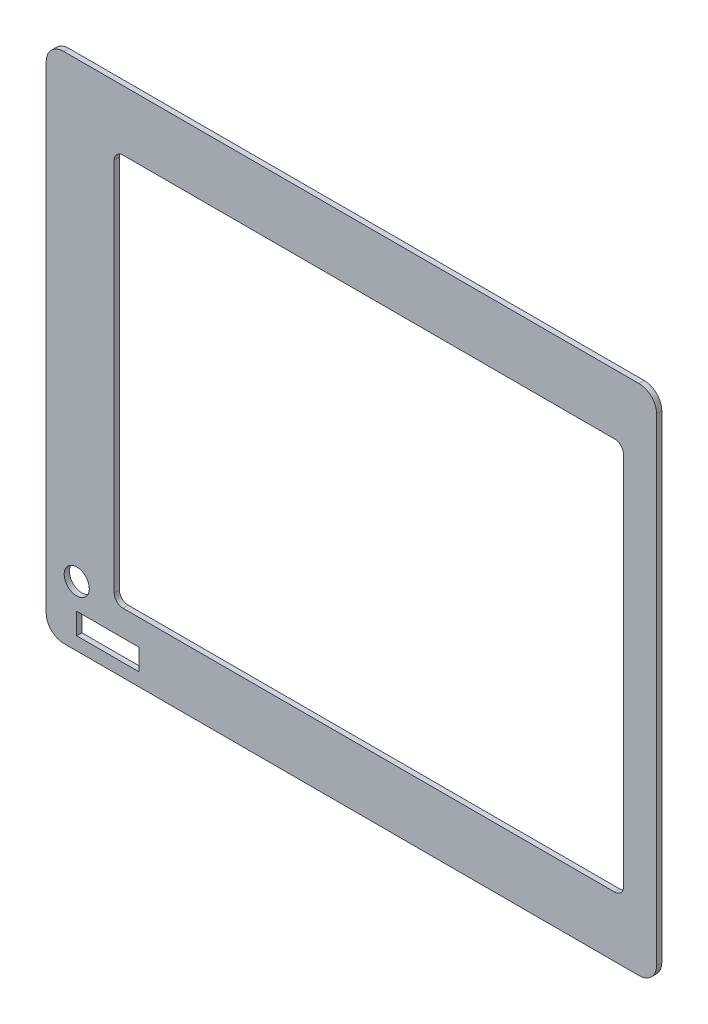
ISO-10303-21;
HEADER;
FILE_DESCRIPTION(('STEP AP214'),'2;1');
FILE_NAME('part.step','',(''),(''),'','','');
FILE_SCHEMA(('AUTOMOTIVE_DESIGN { 1 0 10303 214 1 1 1 1 }'));
ENDSEC;
DATA;
#1=APPLICATION_CONTEXT('core data for automotive mechanical design processes');
#2=APPLICATION_PROTOCOL_DEFINITION('international standard','automotive_design',2000,#1);
#3=PRODUCT_CONTEXT('',#1,'mechanical');
#4=PRODUCT('Part','Part','',(#3));
#5=PRODUCT_RELATED_PRODUCT_CATEGORY('part','',(#4));
#6=PRODUCT_DEFINITION_FORMATION('','',#4);
#7=PRODUCT_DEFINITION_CONTEXT('part definition',#1,'design');
#8=PRODUCT_DEFINITION('design','',#6,#7);
#9=PRODUCT_DEFINITION_SHAPE('','',#8);
#10=(LENGTH_UNIT() NAMED_UNIT(*) SI_UNIT(.MILLI.,.METRE.));
#11=(NAMED_UNIT(*) PLANE_ANGLE_UNIT() SI_UNIT($,.RADIAN.));
#12=(NAMED_UNIT(*) SI_UNIT($,.STERADIAN.) SOLID_ANGLE_UNIT());
#13=UNCERTAINTY_MEASURE_WITH_UNIT(LENGTH_MEASURE(1.E-05),#10,'distance_accuracy_value','');
#14=(GEOMETRIC_REPRESENTATION_CONTEXT(3) GLOBAL_UNCERTAINTY_ASSIGNED_CONTEXT((#13)) GLOBAL_UNIT_ASSIGNED_CONTEXT((#10,
#11,#12)) REPRESENTATION_CONTEXT('',''));
#15=CARTESIAN_POINT('',(0.,0.,0.));
#16=DIRECTION('',(0.,0.,1.));
#17=DIRECTION('',(1.,0.,0.));
#18=AXIS2_PLACEMENT_3D('',#15,#16,#17);
#19=CARTESIAN_POINT('',(0.,0.,6.));
#20=DIRECTION('',(0.,0.,-1.));
#21=DIRECTION('',(-1.,0.,0.));
#22=AXIS2_PLACEMENT_3D('',#19,#20,#21);
#23=PLANE('',#22);
#24=CARTESIAN_POINT('',(-315.,-225.,6.));
#25=DIRECTION('',(0.,0.,1.));
#26=DIRECTION('',(1.,0.,0.));
#27=AXIS2_PLACEMENT_3D('',#24,#25,#26);
#28=CIRCLE('',#27,14.4);
#29=CARTESIAN_POINT('',(-300.6,-225.,6.));
#30=VERTEX_POINT('',#29);
#31=EDGE_CURVE('E191',#30,#30,#28,.T.);
#32=ORIENTED_EDGE('',*,*,#31,.F.);
#33=EDGE_LOOP('',(#32));
#34=FACE_BOUND('',#33,.T.);
#35=DIRECTION('',(0.,1.,0.));
#36=VECTOR('',#35,1.);
#37=CARTESIAN_POINT('',(-243.7,-279.,6.));
#38=LINE('',#37,#36);
#39=CARTESIAN_POINT('',(-243.7,-279.,6.));
#40=VERTEX_POINT('',#39);
#41=CARTESIAN_POINT('',(-243.7,-254.6,6.));
#42=VERTEX_POINT('',#41);
#43=EDGE_CURVE('E206',#40,#42,#38,.T.);
#44=ORIENTED_EDGE('',*,*,#43,.F.);
#45=DIRECTION('',(1.,0.,0.));
#46=VECTOR('',#45,1.);
#47=CARTESIAN_POINT('',(-315.,-279.,6.));
#48=LINE('',#47,#46);
#49=CARTESIAN_POINT('',(-315.,-279.,6.));
#50=VERTEX_POINT('',#49);
#51=EDGE_CURVE('E63',#50,#40,#48,.T.);
#52=ORIENTED_EDGE('',*,*,#51,.F.);
#53=DIRECTION('',(0.,1.,0.));
#54=VECTOR('',#53,1.);
#55=CARTESIAN_POINT('',(-315.,-279.,6.));
#56=LINE('',#55,#54);
#57=CARTESIAN_POINT('',(-315.,-254.6,6.));
#58=VERTEX_POINT('',#57);
#59=EDGE_CURVE('E194',#50,#58,#56,.T.);
#60=ORIENTED_EDGE('',*,*,#59,.T.);
#61=DIRECTION('',(1.,0.,0.));
#62=VECTOR('',#61,1.);
#63=CARTESIAN_POINT('',(-315.,-254.6,6.));
#64=LINE('',#63,#62);
#65=EDGE_CURVE('E200',#58,#42,#64,.T.);
#66=ORIENTED_EDGE('',*,*,#65,.T.);
#67=EDGE_LOOP('',(#44,#52,#60,#66));
#68=FACE_BOUND('',#67,.T.);
#69=DIRECTION('',(-1.,0.,0.));
#70=VECTOR('',#69,1.);
#71=CARTESIAN_POINT('',(-350.,294.,6.));
#72=LINE('',#71,#70);
#73=CARTESIAN_POINT('',(330.,294.,6.));
#74=VERTEX_POINT('',#73);
#75=CARTESIAN_POINT('',(-330.,294.,6.));
#76=VERTEX_POINT('',#75);
#77=EDGE_CURVE('E255',#74,#76,#72,.T.);
#78=ORIENTED_EDGE('',*,*,#77,.T.);
#79=CARTESIAN_POINT('',(-330.,274.,6.));
#80=DIRECTION('',(0.,0.,-1.));
#81=DIRECTION('',(-1.,0.,0.));
#82=AXIS2_PLACEMENT_3D('',#79,#80,#81);
#83=CIRCLE('',#82,20.);
#84=CARTESIAN_POINT('',(-350.,274.,6.));
#85=VERTEX_POINT('',#84);
#86=EDGE_CURVE('E318',#76,#85,#83,.F.);
#87=ORIENTED_EDGE('',*,*,#86,.T.);
#88=DIRECTION('',(0.,-1.,0.));
#89=VECTOR('',#88,1.);
#90=CARTESIAN_POINT('',(-350.,-294.,6.));
#91=LINE('',#90,#89);
#92=CARTESIAN_POINT('',(-350.,-274.,6.));
#93=VERTEX_POINT('',#92);
#94=EDGE_CURVE('E260',#85,#93,#91,.T.);
#95=ORIENTED_EDGE('',*,*,#94,.T.);
#96=CARTESIAN_POINT('',(-330.,-274.,6.));
#97=DIRECTION('',(0.,0.,-1.));
#98=DIRECTION('',(-1.,0.,0.));
#99=AXIS2_PLACEMENT_3D('',#96,#97,#98);
#100=CIRCLE('',#99,20.);
#101=CARTESIAN_POINT('',(-330.,-294.,6.));
#102=VERTEX_POINT('',#101);
#103=EDGE_CURVE('E309',#93,#102,#100,.F.);
#104=ORIENTED_EDGE('',*,*,#103,.T.);
#105=DIRECTION('',(1.,0.,0.));
#106=VECTOR('',#105,1.);
#107=CARTESIAN_POINT('',(-350.,-294.,6.));
#108=LINE('',#107,#106);
#109=CARTESIAN_POINT('',(330.,-294.,6.));
#110=VERTEX_POINT('',#109);
#111=EDGE_CURVE('E264',#102,#110,#108,.T.);
#112=ORIENTED_EDGE('',*,*,#111,.T.);
#113=CARTESIAN_POINT('',(330.,-274.,6.));
#114=DIRECTION('',(0.,0.,-1.));
#115=DIRECTION('',(-1.,0.,0.));
#116=AXIS2_PLACEMENT_3D('',#113,#114,#115);
#117=CIRCLE('',#116,20.);
#118=CARTESIAN_POINT('',(350.,-274.,6.));
#119=VERTEX_POINT('',#118);
#120=EDGE_CURVE('E312',#110,#119,#117,.F.);
#121=ORIENTED_EDGE('',*,*,#120,.T.);
#122=DIRECTION('',(0.,1.,0.));
#123=VECTOR('',#122,1.);
#124=CARTESIAN_POINT('',(350.,-294.,6.));
#125=LINE('',#124,#123);
#126=CARTESIAN_POINT('',(350.,274.,6.));
#127=VERTEX_POINT('',#126);
#128=EDGE_CURVE('E251',#119,#127,#125,.T.);
#129=ORIENTED_EDGE('',*,*,#128,.T.);
#130=CARTESIAN_POINT('',(330.,274.,6.));
#131=DIRECTION('',(0.,0.,-1.));
#132=DIRECTION('',(-1.,0.,0.));
#133=AXIS2_PLACEMENT_3D('',#130,#131,#132);
#134=CIRCLE('',#133,20.);
#135=EDGE_CURVE('E315',#127,#74,#134,.F.);
#136=ORIENTED_EDGE('',*,*,#135,.T.);
#137=EDGE_LOOP('',(#78,#87,#95,#104,#112,#121,#129,#136));
#138=FACE_BOUND('',#137,.T.);
#139=CARTESIAN_POINT('',(-262.,-215.,6.));
#140=DIRECTION('',(0.,0.,-1.));
#141=DIRECTION('',(-1.,0.,0.));
#142=AXIS2_PLACEMENT_3D('',#139,#140,#141);
#143=CIRCLE('',#142,10.);
#144=CARTESIAN_POINT('',(-262.,-225.,6.));
#145=VERTEX_POINT('',#144);
#146=CARTESIAN_POINT('',(-272.,-215.,6.));
#147=VERTEX_POINT('',#146);
#148=EDGE_CURVE('E71',#145,#147,#143,.T.);
#149=ORIENTED_EDGE('',*,*,#148,.T.);
#150=DIRECTION('',(0.,1.,0.));
#151=VECTOR('',#150,1.);
#152=CARTESIAN_POINT('',(-272.,-215.,6.));
#153=LINE('',#152,#151);
#154=CARTESIAN_POINT('',(-272.,215.,6.));
#155=VERTEX_POINT('',#154);
#156=EDGE_CURVE('E208',#147,#155,#153,.T.);
#157=ORIENTED_EDGE('',*,*,#156,.T.);
#158=CARTESIAN_POINT('',(-262.,215.,6.));
#159=DIRECTION('',(0.,0.,-1.));
#160=DIRECTION('',(-1.,0.,0.));
#161=AXIS2_PLACEMENT_3D('',#158,#159,#160);
#162=CIRCLE('',#161,10.);
#163=CARTESIAN_POINT('',(-262.,225.,6.));
#164=VERTEX_POINT('',#163);
#165=EDGE_CURVE('E217',#155,#164,#162,.T.);
#166=ORIENTED_EDGE('',*,*,#165,.T.);
#167=DIRECTION('',(1.,0.,0.));
#168=VECTOR('',#167,1.);
#169=CARTESIAN_POINT('',(-262.,225.,6.));
#170=LINE('',#169,#168);
#171=CARTESIAN_POINT('',(302.,225.,6.));
#172=VERTEX_POINT('',#171);
#173=EDGE_CURVE('E220',#164,#172,#170,.T.);
#174=ORIENTED_EDGE('',*,*,#173,.T.);
#175=CARTESIAN_POINT('',(302.,215.,6.));
#176=DIRECTION('',(0.,0.,-1.));
#177=DIRECTION('',(-1.,0.,0.));
#178=AXIS2_PLACEMENT_3D('',#175,#176,#177);
#179=CIRCLE('',#178,10.);
#180=CARTESIAN_POINT('',(312.,215.,6.));
#181=VERTEX_POINT('',#180);
#182=EDGE_CURVE('E223',#172,#181,#179,.T.);
#183=ORIENTED_EDGE('',*,*,#182,.T.);
#184=DIRECTION('',(0.,1.,0.));
#185=VECTOR('',#184,1.);
#186=CARTESIAN_POINT('',(312.,-215.,6.));
#187=LINE('',#186,#185);
#188=CARTESIAN_POINT('',(312.,-215.,6.));
#189=VERTEX_POINT('',#188);
#190=EDGE_CURVE('E226',#189,#181,#187,.T.);
#191=ORIENTED_EDGE('',*,*,#190,.F.);
#192=CARTESIAN_POINT('',(302.,-215.,6.));
#193=DIRECTION('',(0.,0.,1.));
#194=DIRECTION('',(1.,0.,0.));
#195=AXIS2_PLACEMENT_3D('',#192,#193,#194);
#196=CIRCLE('',#195,10.);
#197=CARTESIAN_POINT('',(302.,-225.,6.));
#198=VERTEX_POINT('',#197);
#199=EDGE_CURVE('E229',#198,#189,#196,.T.);
#200=ORIENTED_EDGE('',*,*,#199,.F.);
#201=DIRECTION('',(1.,0.,0.));
#202=VECTOR('',#201,1.);
#203=CARTESIAN_POINT('',(-262.,-225.,6.));
#204=LINE('',#203,#202);
#205=EDGE_CURVE('E232',#145,#198,#204,.T.);
#206=ORIENTED_EDGE('',*,*,#205,.F.);
#207=EDGE_LOOP('',(#149,#157,#166,#174,#183,#191,#200,#206));
#208=FACE_BOUND('',#207,.T.);
#209=ADVANCED_FACE('F47',(#34,#68,#138,#208),#23,.F.);
#210=CARTESIAN_POINT('',(0.,0.,0.));
#211=DIRECTION('',(0.,0.,-1.));
#212=DIRECTION('',(-1.,0.,0.));
#213=AXIS2_PLACEMENT_3D('',#210,#211,#212);
#214=PLANE('',#213);
#215=CARTESIAN_POINT('',(-315.,-225.,0.));
#216=DIRECTION('',(0.,0.,-1.));
#217=DIRECTION('',(-1.,0.,0.));
#218=AXIS2_PLACEMENT_3D('',#215,#216,#217);
#219=CIRCLE('',#218,14.4);
#220=CARTESIAN_POINT('',(-329.4,-225.,0.));
#221=VERTEX_POINT('',#220);
#222=EDGE_CURVE('E51',#221,#221,#219,.T.);
#223=ORIENTED_EDGE('',*,*,#222,.F.);
#224=EDGE_LOOP('',(#223));
#225=FACE_BOUND('',#224,.T.);
#226=DIRECTION('',(-1.,0.,0.));
#227=VECTOR('',#226,1.);
#228=CARTESIAN_POINT('',(0.,-279.,0.));
#229=LINE('',#228,#227);
#230=CARTESIAN_POINT('',(-243.7,-279.,0.));
#231=VERTEX_POINT('',#230);
#232=CARTESIAN_POINT('',(-315.,-279.,0.));
#233=VERTEX_POINT('',#232);
#234=EDGE_CURVE('E11',#231,#233,#229,.T.);
#235=ORIENTED_EDGE('',*,*,#234,.F.);
#236=DIRECTION('',(0.,-1.,0.));
#237=VECTOR('',#236,1.);
#238=CARTESIAN_POINT('',(-243.7,0.,0.));
#239=LINE('',#238,#237);
#240=CARTESIAN_POINT('',(-243.7,-254.6,0.));
#241=VERTEX_POINT('',#240);
#242=EDGE_CURVE('E357',#241,#231,#239,.T.);
#243=ORIENTED_EDGE('',*,*,#242,.F.);
#244=DIRECTION('',(-1.,0.,0.));
#245=VECTOR('',#244,1.);
#246=CARTESIAN_POINT('',(0.,-254.6,0.));
#247=LINE('',#246,#245);
#248=CARTESIAN_POINT('',(-315.,-254.6,0.));
#249=VERTEX_POINT('',#248);
#250=EDGE_CURVE('E359',#241,#249,#247,.T.);
#251=ORIENTED_EDGE('',*,*,#250,.T.);
#252=DIRECTION('',(0.,-1.,0.));
#253=VECTOR('',#252,1.);
#254=CARTESIAN_POINT('',(-315.,0.,0.));
#255=LINE('',#254,#253);
#256=EDGE_CURVE('E56',#249,#233,#255,.T.);
#257=ORIENTED_EDGE('',*,*,#256,.T.);
#258=EDGE_LOOP('',(#235,#243,#251,#257));
#259=FACE_BOUND('',#258,.T.);
#260=DIRECTION('',(0.,-1.,0.));
#261=VECTOR('',#260,1.);
#262=CARTESIAN_POINT('',(-350.,-294.,0.));
#263=LINE('',#262,#261);
#264=CARTESIAN_POINT('',(-350.,274.,0.));
#265=VERTEX_POINT('',#264);
#266=CARTESIAN_POINT('',(-350.,-274.,0.));
#267=VERTEX_POINT('',#266);
#268=EDGE_CURVE('E277',#265,#267,#263,.T.);
#269=ORIENTED_EDGE('',*,*,#268,.F.);
#270=CARTESIAN_POINT('',(-330.,274.,0.));
#271=DIRECTION('',(0.,0.,-1.));
#272=DIRECTION('',(-1.,0.,0.));
#273=AXIS2_PLACEMENT_3D('',#270,#271,#272);
#274=CIRCLE('',#273,20.);
#275=CARTESIAN_POINT('',(-330.,294.,0.));
#276=VERTEX_POINT('',#275);
#277=EDGE_CURVE('E299',#265,#276,#274,.T.);
#278=ORIENTED_EDGE('',*,*,#277,.T.);
#279=DIRECTION('',(-1.,0.,0.));
#280=VECTOR('',#279,1.);
#281=CARTESIAN_POINT('',(-350.,294.,0.));
#282=LINE('',#281,#280);
#283=CARTESIAN_POINT('',(330.,294.,0.));
#284=VERTEX_POINT('',#283);
#285=EDGE_CURVE('E273',#284,#276,#282,.T.);
#286=ORIENTED_EDGE('',*,*,#285,.F.);
#287=CARTESIAN_POINT('',(330.,274.,0.));
#288=DIRECTION('',(0.,0.,-1.));
#289=DIRECTION('',(-1.,0.,0.));
#290=AXIS2_PLACEMENT_3D('',#287,#288,#289);
#291=CIRCLE('',#290,20.);
#292=CARTESIAN_POINT('',(350.,274.,0.));
#293=VERTEX_POINT('',#292);
#294=EDGE_CURVE('E296',#284,#293,#291,.T.);
#295=ORIENTED_EDGE('',*,*,#294,.T.);
#296=DIRECTION('',(0.,1.,0.));
#297=VECTOR('',#296,1.);
#298=CARTESIAN_POINT('',(350.,-294.,0.));
#299=LINE('',#298,#297);
#300=CARTESIAN_POINT('',(350.,-274.,0.));
#301=VERTEX_POINT('',#300);
#302=EDGE_CURVE('E269',#301,#293,#299,.T.);
#303=ORIENTED_EDGE('',*,*,#302,.F.);
#304=CARTESIAN_POINT('',(330.,-274.,0.));
#305=DIRECTION('',(0.,0.,-1.));
#306=DIRECTION('',(-1.,0.,0.));
#307=AXIS2_PLACEMENT_3D('',#304,#305,#306);
#308=CIRCLE('',#307,20.);
#309=CARTESIAN_POINT('',(330.,-294.,0.));
#310=VERTEX_POINT('',#309);
#311=EDGE_CURVE('E293',#301,#310,#308,.T.);
#312=ORIENTED_EDGE('',*,*,#311,.T.);
#313=DIRECTION('',(1.,0.,0.));
#314=VECTOR('',#313,1.);
#315=CARTESIAN_POINT('',(-350.,-294.,0.));
#316=LINE('',#315,#314);
#317=CARTESIAN_POINT('',(-330.,-294.,0.));
#318=VERTEX_POINT('',#317);
#319=EDGE_CURVE('E256',#318,#310,#316,.T.);
#320=ORIENTED_EDGE('',*,*,#319,.F.);
#321=CARTESIAN_POINT('',(-330.,-274.,0.));
#322=DIRECTION('',(0.,0.,-1.));
#323=DIRECTION('',(-1.,0.,0.));
#324=AXIS2_PLACEMENT_3D('',#321,#322,#323);
#325=CIRCLE('',#324,20.);
#326=EDGE_CURVE('E290',#318,#267,#325,.T.);
#327=ORIENTED_EDGE('',*,*,#326,.T.);
#328=EDGE_LOOP('',(#269,#278,#286,#295,#303,#312,#320,#327));
#329=FACE_BOUND('',#328,.T.);
#330=DIRECTION('',(0.,-1.,0.));
#331=VECTOR('',#330,1.);
#332=CARTESIAN_POINT('',(-272.,0.,0.));
#333=LINE('',#332,#331);
#334=CARTESIAN_POINT('',(-272.,215.,0.));
#335=VERTEX_POINT('',#334);
#336=CARTESIAN_POINT('',(-272.,-215.,0.));
#337=VERTEX_POINT('',#336);
#338=EDGE_CURVE('E351',#335,#337,#333,.T.);
#339=ORIENTED_EDGE('',*,*,#338,.T.);
#340=CARTESIAN_POINT('',(-262.,-215.,0.));
#341=DIRECTION('',(0.,0.,-1.));
#342=DIRECTION('',(-1.,0.,0.));
#343=AXIS2_PLACEMENT_3D('',#340,#341,#342);
#344=CIRCLE('',#343,10.);
#345=CARTESIAN_POINT('',(-262.,-225.,0.));
#346=VERTEX_POINT('',#345);
#347=EDGE_CURVE('E354',#337,#346,#344,.F.);
#348=ORIENTED_EDGE('',*,*,#347,.T.);
#349=DIRECTION('',(-1.,0.,0.));
#350=VECTOR('',#349,1.);
#351=CARTESIAN_POINT('',(0.,-225.,0.));
#352=LINE('',#351,#350);
#353=CARTESIAN_POINT('',(302.,-225.,0.));
#354=VERTEX_POINT('',#353);
#355=EDGE_CURVE('E335',#354,#346,#352,.T.);
#356=ORIENTED_EDGE('',*,*,#355,.F.);
#357=CARTESIAN_POINT('',(302.,-215.,0.));
#358=DIRECTION('',(0.,0.,-1.));
#359=DIRECTION('',(-1.,0.,0.));
#360=AXIS2_PLACEMENT_3D('',#357,#358,#359);
#361=CIRCLE('',#360,10.);
#362=CARTESIAN_POINT('',(312.,-215.,0.));
#363=VERTEX_POINT('',#362);
#364=EDGE_CURVE('E337',#363,#354,#361,.T.);
#365=ORIENTED_EDGE('',*,*,#364,.F.);
#366=DIRECTION('',(0.,-1.,0.));
#367=VECTOR('',#366,1.);
#368=CARTESIAN_POINT('',(312.,0.,0.));
#369=LINE('',#368,#367);
#370=CARTESIAN_POINT('',(312.,215.,0.));
#371=VERTEX_POINT('',#370);
#372=EDGE_CURVE('E340',#371,#363,#369,.T.);
#373=ORIENTED_EDGE('',*,*,#372,.F.);
#374=CARTESIAN_POINT('',(302.,215.,0.));
#375=DIRECTION('',(0.,0.,-1.));
#376=DIRECTION('',(-1.,0.,0.));
#377=AXIS2_PLACEMENT_3D('',#374,#375,#376);
#378=CIRCLE('',#377,10.);
#379=CARTESIAN_POINT('',(302.,225.,0.));
#380=VERTEX_POINT('',#379);
#381=EDGE_CURVE('E342',#371,#380,#378,.F.);
#382=ORIENTED_EDGE('',*,*,#381,.T.);
#383=DIRECTION('',(-1.,0.,0.));
#384=VECTOR('',#383,1.);
#385=CARTESIAN_POINT('',(0.,225.,0.));
#386=LINE('',#385,#384);
#387=CARTESIAN_POINT('',(-262.,225.,0.));
#388=VERTEX_POINT('',#387);
#389=EDGE_CURVE('E345',#380,#388,#386,.T.);
#390=ORIENTED_EDGE('',*,*,#389,.T.);
#391=CARTESIAN_POINT('',(-262.,215.,0.));
#392=DIRECTION('',(0.,0.,-1.));
#393=DIRECTION('',(-1.,0.,0.));
#394=AXIS2_PLACEMENT_3D('',#391,#392,#393);
#395=CIRCLE('',#394,10.);
#396=EDGE_CURVE('E348',#388,#335,#395,.F.);
#397=ORIENTED_EDGE('',*,*,#396,.T.);
#398=EDGE_LOOP('',(#339,#348,#356,#365,#373,#382,#390,#397));
#399=FACE_BOUND('',#398,.T.);
#400=ADVANCED_FACE('F363',(#225,#259,#329,#399),#214,.T.);
#401=CARTESIAN_POINT('',(350.,-294.,6.));
#402=DIRECTION('',(-1.,0.,0.));
#403=DIRECTION('',(0.,0.,1.));
#404=AXIS2_PLACEMENT_3D('',#401,#402,#403);
#405=PLANE('',#404);
#406=ORIENTED_EDGE('',*,*,#302,.T.);
#407=DIRECTION('',(0.,0.,-1.));
#408=VECTOR('',#407,1.);
#409=CARTESIAN_POINT('',(350.,274.,6.));
#410=LINE('',#409,#408);
#411=EDGE_CURVE('E325',#293,#127,#410,.F.);
#412=ORIENTED_EDGE('',*,*,#411,.T.);
#413=ORIENTED_EDGE('',*,*,#128,.F.);
#414=DIRECTION('',(0.,0.,-1.));
#415=VECTOR('',#414,1.);
#416=CARTESIAN_POINT('',(350.,-274.,6.));
#417=LINE('',#416,#415);
#418=EDGE_CURVE('E321',#119,#301,#417,.T.);
#419=ORIENTED_EDGE('',*,*,#418,.T.);
#420=EDGE_LOOP('',(#406,#412,#413,#419));
#421=FACE_BOUND('',#420,.T.);
#422=ADVANCED_FACE('F393',(#421),#405,.F.);
#423=CARTESIAN_POINT('',(-350.,294.,6.));
#424=DIRECTION('',(0.,-1.,0.));
#425=DIRECTION('',(0.,0.,-1.));
#426=AXIS2_PLACEMENT_3D('',#423,#424,#425);
#427=PLANE('',#426);
#428=ORIENTED_EDGE('',*,*,#285,.T.);
#429=DIRECTION('',(0.,0.,-1.));
#430=VECTOR('',#429,1.);
#431=CARTESIAN_POINT('',(-330.,294.,6.));
#432=LINE('',#431,#430);
#433=EDGE_CURVE('E306',#276,#76,#432,.F.);
#434=ORIENTED_EDGE('',*,*,#433,.T.);
#435=ORIENTED_EDGE('',*,*,#77,.F.);
#436=DIRECTION('',(0.,0.,-1.));
#437=VECTOR('',#436,1.);
#438=CARTESIAN_POINT('',(330.,294.,6.));
#439=LINE('',#438,#437);
#440=EDGE_CURVE('E302',#74,#284,#439,.T.);
#441=ORIENTED_EDGE('',*,*,#440,.T.);
#442=EDGE_LOOP('',(#428,#434,#435,#441));
#443=FACE_BOUND('',#442,.T.);
#444=ADVANCED_FACE('F409',(#443),#427,.F.);
#445=CARTESIAN_POINT('',(-350.,-294.,6.));
#446=DIRECTION('',(1.,0.,0.));
#447=DIRECTION('',(0.,0.,-1.));
#448=AXIS2_PLACEMENT_3D('',#445,#446,#447);
#449=PLANE('',#448);
#450=ORIENTED_EDGE('',*,*,#94,.F.);
#451=DIRECTION('',(0.,0.,-1.));
#452=VECTOR('',#451,1.);
#453=CARTESIAN_POINT('',(-350.,274.,6.));
#454=LINE('',#453,#452);
#455=EDGE_CURVE('E286',#85,#265,#454,.T.);
#456=ORIENTED_EDGE('',*,*,#455,.T.);
#457=ORIENTED_EDGE('',*,*,#268,.T.);
#458=DIRECTION('',(0.,0.,-1.));
#459=VECTOR('',#458,1.);
#460=CARTESIAN_POINT('',(-350.,-274.,6.));
#461=LINE('',#460,#459);
#462=EDGE_CURVE('E268',#267,#93,#461,.F.);
#463=ORIENTED_EDGE('',*,*,#462,.T.);
#464=EDGE_LOOP('',(#450,#456,#457,#463));
#465=FACE_BOUND('',#464,.T.);
#466=ADVANCED_FACE('F405',(#465),#449,.F.);
#467=CARTESIAN_POINT('',(-350.,-294.,6.));
#468=DIRECTION('',(0.,1.,0.));
#469=DIRECTION('',(0.,0.,1.));
#470=AXIS2_PLACEMENT_3D('',#467,#468,#469);
#471=PLANE('',#470);
#472=ORIENTED_EDGE('',*,*,#319,.T.);
#473=DIRECTION('',(0.,0.,-1.));
#474=VECTOR('',#473,1.);
#475=CARTESIAN_POINT('',(330.,-294.,6.));
#476=LINE('',#475,#474);
#477=EDGE_CURVE('E332',#310,#110,#476,.F.);
#478=ORIENTED_EDGE('',*,*,#477,.T.);
#479=ORIENTED_EDGE('',*,*,#111,.F.);
#480=DIRECTION('',(0.,0.,-1.));
#481=VECTOR('',#480,1.);
#482=CARTESIAN_POINT('',(-330.,-294.,6.));
#483=LINE('',#482,#481);
#484=EDGE_CURVE('E328',#102,#318,#483,.T.);
#485=ORIENTED_EDGE('',*,*,#484,.T.);
#486=EDGE_LOOP('',(#472,#478,#479,#485));
#487=FACE_BOUND('',#486,.T.);
#488=ADVANCED_FACE('F401',(#487),#471,.F.);
#489=CARTESIAN_POINT('',(-330.,274.,6.));
#490=DIRECTION('',(0.,0.,-1.));
#491=DIRECTION('',(-1.,0.,0.));
#492=AXIS2_PLACEMENT_3D('',#489,#490,#491);
#493=CYLINDRICAL_SURFACE('',#492,20.);
#494=ORIENTED_EDGE('',*,*,#86,.F.);
#495=ORIENTED_EDGE('',*,*,#433,.F.);
#496=ORIENTED_EDGE('',*,*,#277,.F.);
#497=ORIENTED_EDGE('',*,*,#455,.F.);
#498=EDGE_LOOP('',(#494,#495,#496,#497));
#499=FACE_BOUND('',#498,.T.);
#500=ADVANCED_FACE('F404',(#499),#493,.T.);
#501=CARTESIAN_POINT('',(330.,274.,6.));
#502=DIRECTION('',(0.,0.,-1.));
#503=DIRECTION('',(-1.,0.,0.));
#504=AXIS2_PLACEMENT_3D('',#501,#502,#503);
#505=CYLINDRICAL_SURFACE('',#504,20.);
#506=ORIENTED_EDGE('',*,*,#135,.F.);
#507=ORIENTED_EDGE('',*,*,#411,.F.);
#508=ORIENTED_EDGE('',*,*,#294,.F.);
#509=ORIENTED_EDGE('',*,*,#440,.F.);
#510=EDGE_LOOP('',(#506,#507,#508,#509));
#511=FACE_BOUND('',#510,.T.);
#512=ADVANCED_FACE('F419',(#511),#505,.T.);
#513=CARTESIAN_POINT('',(330.,-274.,6.));
#514=DIRECTION('',(0.,0.,-1.));
#515=DIRECTION('',(-1.,0.,0.));
#516=AXIS2_PLACEMENT_3D('',#513,#514,#515);
#517=CYLINDRICAL_SURFACE('',#516,20.);
#518=ORIENTED_EDGE('',*,*,#120,.F.);
#519=ORIENTED_EDGE('',*,*,#477,.F.);
#520=ORIENTED_EDGE('',*,*,#311,.F.);
#521=ORIENTED_EDGE('',*,*,#418,.F.);
#522=EDGE_LOOP('',(#518,#519,#520,#521));
#523=FACE_BOUND('',#522,.T.);
#524=ADVANCED_FACE('F422',(#523),#517,.T.);
#525=CARTESIAN_POINT('',(-330.,-274.,6.));
#526=DIRECTION('',(0.,0.,-1.));
#527=DIRECTION('',(-1.,0.,0.));
#528=AXIS2_PLACEMENT_3D('',#525,#526,#527);
#529=CYLINDRICAL_SURFACE('',#528,20.);
#530=ORIENTED_EDGE('',*,*,#103,.F.);
#531=ORIENTED_EDGE('',*,*,#462,.F.);
#532=ORIENTED_EDGE('',*,*,#326,.F.);
#533=ORIENTED_EDGE('',*,*,#484,.F.);
#534=EDGE_LOOP('',(#530,#531,#532,#533));
#535=FACE_BOUND('',#534,.T.);
#536=ADVANCED_FACE('F49',(#535),#529,.T.);
#537=CARTESIAN_POINT('',(-262.,-215.,-4.));
#538=DIRECTION('',(0.,0.,1.));
#539=DIRECTION('',(1.,0.,0.));
#540=AXIS2_PLACEMENT_3D('',#537,#538,#539);
#541=CYLINDRICAL_SURFACE('',#540,10.);
#542=DIRECTION('',(0.,0.,1.));
#543=VECTOR('',#542,1.);
#544=CARTESIAN_POINT('',(-272.,-215.,-4.));
#545=LINE('',#544,#543);
#546=EDGE_CURVE('E249',#337,#147,#545,.T.);
#547=ORIENTED_EDGE('',*,*,#546,.T.);
#548=ORIENTED_EDGE('',*,*,#148,.F.);
#549=DIRECTION('',(0.,0.,1.));
#550=VECTOR('',#549,1.);
#551=CARTESIAN_POINT('',(-262.,-225.,-4.));
#552=LINE('',#551,#550);
#553=EDGE_CURVE('E235',#346,#145,#552,.T.);
#554=ORIENTED_EDGE('',*,*,#553,.F.);
#555=ORIENTED_EDGE('',*,*,#347,.F.);
#556=EDGE_LOOP('',(#547,#548,#554,#555));
#557=FACE_BOUND('',#556,.T.);
#558=ADVANCED_FACE('F398',(#557),#541,.F.);
#559=CARTESIAN_POINT('',(-272.,-215.,-4.));
#560=DIRECTION('',(1.,0.,0.));
#561=DIRECTION('',(0.,0.,-1.));
#562=AXIS2_PLACEMENT_3D('',#559,#560,#561);
#563=PLANE('',#562);
#564=DIRECTION('',(0.,0.,1.));
#565=VECTOR('',#564,1.);
#566=CARTESIAN_POINT('',(-272.,215.,-4.));
#567=LINE('',#566,#565);
#568=EDGE_CURVE('E247',#335,#155,#567,.T.);
#569=ORIENTED_EDGE('',*,*,#568,.T.);
#570=ORIENTED_EDGE('',*,*,#156,.F.);
#571=ORIENTED_EDGE('',*,*,#546,.F.);
#572=ORIENTED_EDGE('',*,*,#338,.F.);
#573=EDGE_LOOP('',(#569,#570,#571,#572));
#574=FACE_BOUND('',#573,.T.);
#575=ADVANCED_FACE('F455',(#574),#563,.T.);
#576=CARTESIAN_POINT('',(-262.,215.,-4.));
#577=DIRECTION('',(0.,0.,1.));
#578=DIRECTION('',(1.,0.,0.));
#579=AXIS2_PLACEMENT_3D('',#576,#577,#578);
#580=CYLINDRICAL_SURFACE('',#579,10.);
#581=DIRECTION('',(0.,0.,1.));
#582=VECTOR('',#581,1.);
#583=CARTESIAN_POINT('',(-262.,225.,-4.));
#584=LINE('',#583,#582);
#585=EDGE_CURVE('E245',#388,#164,#584,.T.);
#586=ORIENTED_EDGE('',*,*,#585,.T.);
#587=ORIENTED_EDGE('',*,*,#165,.F.);
#588=ORIENTED_EDGE('',*,*,#568,.F.);
#589=ORIENTED_EDGE('',*,*,#396,.F.);
#590=EDGE_LOOP('',(#586,#587,#588,#589));
#591=FACE_BOUND('',#590,.T.);
#592=ADVANCED_FACE('F459',(#591),#580,.F.);
#593=CARTESIAN_POINT('',(-262.,225.,-4.));
#594=DIRECTION('',(0.,-1.,0.));
#595=DIRECTION('',(0.,0.,-1.));
#596=AXIS2_PLACEMENT_3D('',#593,#594,#595);
#597=PLANE('',#596);
#598=DIRECTION('',(0.,0.,1.));
#599=VECTOR('',#598,1.);
#600=CARTESIAN_POINT('',(302.,225.,-4.));
#601=LINE('',#600,#599);
#602=EDGE_CURVE('E243',#380,#172,#601,.T.);
#603=ORIENTED_EDGE('',*,*,#602,.T.);
#604=ORIENTED_EDGE('',*,*,#173,.F.);
#605=ORIENTED_EDGE('',*,*,#585,.F.);
#606=ORIENTED_EDGE('',*,*,#389,.F.);
#607=EDGE_LOOP('',(#603,#604,#605,#606));
#608=FACE_BOUND('',#607,.T.);
#609=ADVANCED_FACE('F474',(#608),#597,.T.);
#610=CARTESIAN_POINT('',(302.,215.,-4.));
#611=DIRECTION('',(0.,0.,1.));
#612=DIRECTION('',(1.,0.,0.));
#613=AXIS2_PLACEMENT_3D('',#610,#611,#612);
#614=CYLINDRICAL_SURFACE('',#613,10.);
#615=DIRECTION('',(0.,0.,1.));
#616=VECTOR('',#615,1.);
#617=CARTESIAN_POINT('',(312.,215.,-4.));
#618=LINE('',#617,#616);
#619=EDGE_CURVE('E241',#371,#181,#618,.T.);
#620=ORIENTED_EDGE('',*,*,#619,.T.);
#621=ORIENTED_EDGE('',*,*,#182,.F.);
#622=ORIENTED_EDGE('',*,*,#602,.F.);
#623=ORIENTED_EDGE('',*,*,#381,.F.);
#624=EDGE_LOOP('',(#620,#621,#622,#623));
#625=FACE_BOUND('',#624,.T.);
#626=ADVANCED_FACE('F479',(#625),#614,.F.);
#627=CARTESIAN_POINT('',(312.,-215.,-4.));
#628=DIRECTION('',(1.,0.,0.));
#629=DIRECTION('',(0.,0.,-1.));
#630=AXIS2_PLACEMENT_3D('',#627,#628,#629);
#631=PLANE('',#630);
#632=ORIENTED_EDGE('',*,*,#372,.T.);
#633=DIRECTION('',(0.,0.,1.));
#634=VECTOR('',#633,1.);
#635=CARTESIAN_POINT('',(312.,-215.,-4.));
#636=LINE('',#635,#634);
#637=EDGE_CURVE('E239',#363,#189,#636,.T.);
#638=ORIENTED_EDGE('',*,*,#637,.T.);
#639=ORIENTED_EDGE('',*,*,#190,.T.);
#640=ORIENTED_EDGE('',*,*,#619,.F.);
#641=EDGE_LOOP('',(#632,#638,#639,#640));
#642=FACE_BOUND('',#641,.T.);
#643=ADVANCED_FACE('F483',(#642),#631,.F.);
#644=CARTESIAN_POINT('',(302.,-215.,-4.));
#645=DIRECTION('',(0.,0.,1.));
#646=DIRECTION('',(1.,0.,0.));
#647=AXIS2_PLACEMENT_3D('',#644,#645,#646);
#648=CYLINDRICAL_SURFACE('',#647,10.);
#649=ORIENTED_EDGE('',*,*,#364,.T.);
#650=DIRECTION('',(0.,0.,1.));
#651=VECTOR('',#650,1.);
#652=CARTESIAN_POINT('',(302.,-225.,-4.));
#653=LINE('',#652,#651);
#654=EDGE_CURVE('E237',#354,#198,#653,.T.);
#655=ORIENTED_EDGE('',*,*,#654,.T.);
#656=ORIENTED_EDGE('',*,*,#199,.T.);
#657=ORIENTED_EDGE('',*,*,#637,.F.);
#658=EDGE_LOOP('',(#649,#655,#656,#657));
#659=FACE_BOUND('',#658,.T.);
#660=ADVANCED_FACE('F487',(#659),#648,.F.);
#661=CARTESIAN_POINT('',(-262.,-225.,-4.));
#662=DIRECTION('',(0.,-1.,0.));
#663=DIRECTION('',(0.,0.,-1.));
#664=AXIS2_PLACEMENT_3D('',#661,#662,#663);
#665=PLANE('',#664);
#666=ORIENTED_EDGE('',*,*,#355,.T.);
#667=ORIENTED_EDGE('',*,*,#553,.T.);
#668=ORIENTED_EDGE('',*,*,#205,.T.);
#669=ORIENTED_EDGE('',*,*,#654,.F.);
#670=EDGE_LOOP('',(#666,#667,#668,#669));
#671=FACE_BOUND('',#670,.T.);
#672=ADVANCED_FACE('F466',(#671),#665,.F.);
#673=CARTESIAN_POINT('',(-315.,-279.,-4.));
#674=DIRECTION('',(0.,-1.,0.));
#675=DIRECTION('',(0.,0.,-1.));
#676=AXIS2_PLACEMENT_3D('',#673,#674,#675);
#677=PLANE('',#676);
#678=ORIENTED_EDGE('',*,*,#234,.T.);
#679=DIRECTION('',(0.,0.,1.));
#680=VECTOR('',#679,1.);
#681=CARTESIAN_POINT('',(-315.,-279.,-4.));
#682=LINE('',#681,#680);
#683=EDGE_CURVE('E184',#233,#50,#682,.T.);
#684=ORIENTED_EDGE('',*,*,#683,.T.);
#685=ORIENTED_EDGE('',*,*,#51,.T.);
#686=DIRECTION('',(0.,0.,1.));
#687=VECTOR('',#686,1.);
#688=CARTESIAN_POINT('',(-243.7,-279.,-4.));
#689=LINE('',#688,#687);
#690=EDGE_CURVE('E201',#231,#40,#689,.T.);
#691=ORIENTED_EDGE('',*,*,#690,.F.);
#692=EDGE_LOOP('',(#678,#684,#685,#691));
#693=FACE_BOUND('',#692,.T.);
#694=ADVANCED_FACE('F186',(#693),#677,.F.);
#695=CARTESIAN_POINT('',(-315.,-279.,-4.));
#696=DIRECTION('',(1.,0.,0.));
#697=DIRECTION('',(0.,0.,-1.));
#698=AXIS2_PLACEMENT_3D('',#695,#696,#697);
#699=PLANE('',#698);
#700=DIRECTION('',(0.,0.,1.));
#701=VECTOR('',#700,1.);
#702=CARTESIAN_POINT('',(-315.,-254.6,-4.));
#703=LINE('',#702,#701);
#704=EDGE_CURVE('E190',#249,#58,#703,.T.);
#705=ORIENTED_EDGE('',*,*,#704,.T.);
#706=ORIENTED_EDGE('',*,*,#59,.F.);
#707=ORIENTED_EDGE('',*,*,#683,.F.);
#708=ORIENTED_EDGE('',*,*,#256,.F.);
#709=EDGE_LOOP('',(#705,#706,#707,#708));
#710=FACE_BOUND('',#709,.T.);
#711=ADVANCED_FACE('F195',(#710),#699,.T.);
#712=CARTESIAN_POINT('',(-315.,-254.6,-4.));
#713=DIRECTION('',(0.,-1.,0.));
#714=DIRECTION('',(0.,0.,-1.));
#715=AXIS2_PLACEMENT_3D('',#712,#713,#714);
#716=PLANE('',#715);
#717=DIRECTION('',(0.,0.,1.));
#718=VECTOR('',#717,1.);
#719=CARTESIAN_POINT('',(-243.7,-254.6,-4.));
#720=LINE('',#719,#718);
#721=EDGE_CURVE('E369',#241,#42,#720,.T.);
#722=ORIENTED_EDGE('',*,*,#721,.T.);
#723=ORIENTED_EDGE('',*,*,#65,.F.);
#724=ORIENTED_EDGE('',*,*,#704,.F.);
#725=ORIENTED_EDGE('',*,*,#250,.F.);
#726=EDGE_LOOP('',(#722,#723,#724,#725));
#727=FACE_BOUND('',#726,.T.);
#728=ADVANCED_FACE('F368',(#727),#716,.T.);
#729=CARTESIAN_POINT('',(-243.7,-279.,-4.));
#730=DIRECTION('',(1.,0.,0.));
#731=DIRECTION('',(0.,0.,-1.));
#732=AXIS2_PLACEMENT_3D('',#729,#730,#731);
#733=PLANE('',#732);
#734=ORIENTED_EDGE('',*,*,#242,.T.);
#735=ORIENTED_EDGE('',*,*,#690,.T.);
#736=ORIENTED_EDGE('',*,*,#43,.T.);
#737=ORIENTED_EDGE('',*,*,#721,.F.);
#738=EDGE_LOOP('',(#734,#735,#736,#737));
#739=FACE_BOUND('',#738,.T.);
#740=ADVANCED_FACE('F374',(#739),#733,.F.);
#741=CARTESIAN_POINT('',(-315.,-225.,-4.));
#742=DIRECTION('',(0.,0.,1.));
#743=DIRECTION('',(1.,0.,0.));
#744=AXIS2_PLACEMENT_3D('',#741,#742,#743);
#745=CYLINDRICAL_SURFACE('',#744,14.4);
#746=ORIENTED_EDGE('',*,*,#222,.T.);
#747=EDGE_LOOP('',(#746));
#748=FACE_BOUND('',#747,.T.);
#749=ORIENTED_EDGE('',*,*,#31,.T.);
#750=EDGE_LOOP('',(#749));
#751=FACE_BOUND('',#750,.T.);
#752=ADVANCED_FACE('F376',(#748,#751),#745,.F.);
#753=CLOSED_SHELL('',(#209,#400,#422,#444,#466,#488,#500,#512,#524,#536,#558,#575,#592,#609,
#626,#643,#660,#672,#694,#711,#728,#740,#752));
#754=MANIFOLD_SOLID_BREP('B2',#753);
#755=ADVANCED_BREP_SHAPE_REPRESENTATION('',(#18,#754),#14);
#756=SHAPE_DEFINITION_REPRESENTATION(#9,#755);
ENDSEC;
END-ISO-10303-21;
